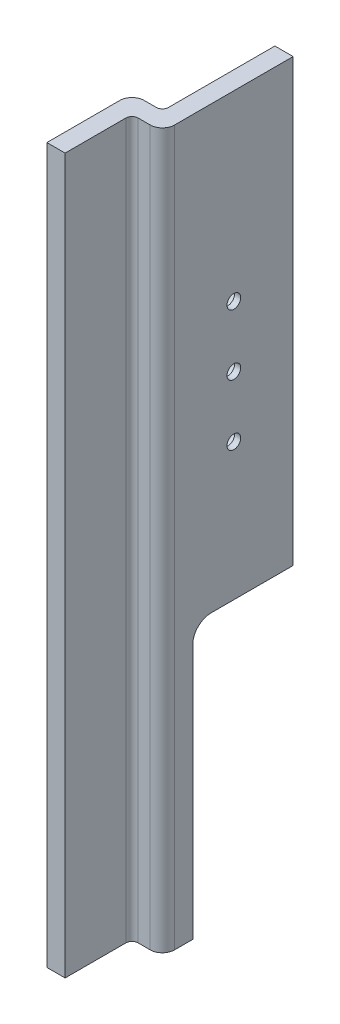
ISO-10303-21;
HEADER;
FILE_DESCRIPTION(('STEP AP214'),'2;1');
FILE_NAME('part.step','',(''),(''),'','','');
FILE_SCHEMA(('AUTOMOTIVE_DESIGN { 1 0 10303 214 1 1 1 1 }'));
ENDSEC;
DATA;
#1=APPLICATION_CONTEXT('core data for automotive mechanical design processes');
#2=APPLICATION_PROTOCOL_DEFINITION('international standard','automotive_design',2000,#1);
#3=PRODUCT_CONTEXT('',#1,'mechanical');
#4=PRODUCT('Part','Part','',(#3));
#5=PRODUCT_RELATED_PRODUCT_CATEGORY('part','',(#4));
#6=PRODUCT_DEFINITION_FORMATION('','',#4);
#7=PRODUCT_DEFINITION_CONTEXT('part definition',#1,'design');
#8=PRODUCT_DEFINITION('design','',#6,#7);
#9=PRODUCT_DEFINITION_SHAPE('','',#8);
#10=(LENGTH_UNIT() NAMED_UNIT(*) SI_UNIT(.MILLI.,.METRE.));
#11=(NAMED_UNIT(*) PLANE_ANGLE_UNIT() SI_UNIT($,.RADIAN.));
#12=(NAMED_UNIT(*) SI_UNIT($,.STERADIAN.) SOLID_ANGLE_UNIT());
#13=UNCERTAINTY_MEASURE_WITH_UNIT(LENGTH_MEASURE(1.E-05),#10,'distance_accuracy_value','');
#14=(GEOMETRIC_REPRESENTATION_CONTEXT(3) GLOBAL_UNCERTAINTY_ASSIGNED_CONTEXT((#13)) GLOBAL_UNIT_ASSIGNED_CONTEXT((#10,
#11,#12)) REPRESENTATION_CONTEXT('',''));
#15=CARTESIAN_POINT('',(0.,0.,0.));
#16=DIRECTION('',(0.,0.,1.));
#17=DIRECTION('',(1.,0.,0.));
#18=AXIS2_PLACEMENT_3D('',#15,#16,#17);
#19=CARTESIAN_POINT('',(-2.,235.,-4.5));
#20=DIRECTION('',(0.,1.,0.));
#21=DIRECTION('',(1.,0.,0.));
#22=AXIS2_PLACEMENT_3D('',#19,#20,#21);
#23=PLANE('',#22);
#24=CARTESIAN_POINT('',(-6.,235.,4.));
#25=DIRECTION('',(0.,-1.,0.));
#26=DIRECTION('',(-0.707106781186547,0.,-0.707106781186548));
#27=AXIS2_PLACEMENT_3D('',#24,#25,#26);
#28=CIRCLE('',#27,4.);
#29=CARTESIAN_POINT('',(-10.,235.,4.));
#30=VERTEX_POINT('',#29);
#31=CARTESIAN_POINT('',(-6.,235.,0.));
#32=VERTEX_POINT('',#31);
#33=EDGE_CURVE('E219',#30,#32,#28,.T.);
#34=ORIENTED_EDGE('',*,*,#33,.F.);
#35=DIRECTION('',(0.,0.,1.));
#36=VECTOR('',#35,1.);
#37=CARTESIAN_POINT('',(-10.,235.,28.));
#38=LINE('',#37,#36);
#39=CARTESIAN_POINT('',(-10.,235.,28.));
#40=VERTEX_POINT('',#39);
#41=EDGE_CURVE('E277',#30,#40,#38,.T.);
#42=ORIENTED_EDGE('',*,*,#41,.T.);
#43=DIRECTION('',(1.,0.,0.));
#44=VECTOR('',#43,1.);
#45=CARTESIAN_POINT('',(-4.,235.,28.));
#46=LINE('',#45,#44);
#47=CARTESIAN_POINT('',(-4.,235.,28.));
#48=VERTEX_POINT('',#47);
#49=EDGE_CURVE('E45',#40,#48,#46,.T.);
#50=ORIENTED_EDGE('',*,*,#49,.T.);
#51=DIRECTION('',(0.,0.,-1.));
#52=VECTOR('',#51,1.);
#53=CARTESIAN_POINT('',(-4.,235.,6.));
#54=LINE('',#53,#52);
#55=CARTESIAN_POINT('',(-4.,235.,8.));
#56=VERTEX_POINT('',#55);
#57=EDGE_CURVE('E248',#48,#56,#54,.T.);
#58=ORIENTED_EDGE('',*,*,#57,.T.);
#59=CARTESIAN_POINT('',(-2.,235.,8.));
#60=DIRECTION('',(0.,1.,0.));
#61=DIRECTION('',(-0.707106781186548,0.,-0.707106781186547));
#62=AXIS2_PLACEMENT_3D('',#59,#60,#61);
#63=CIRCLE('',#62,2.);
#64=CARTESIAN_POINT('',(-2.,235.,6.));
#65=VERTEX_POINT('',#64);
#66=EDGE_CURVE('E318',#65,#56,#63,.T.);
#67=ORIENTED_EDGE('',*,*,#66,.F.);
#68=DIRECTION('',(1.,0.,0.));
#69=VECTOR('',#68,1.);
#70=CARTESIAN_POINT('',(6.,235.,6.));
#71=LINE('',#70,#69);
#72=CARTESIAN_POINT('',(2.,235.,6.));
#73=VERTEX_POINT('',#72);
#74=EDGE_CURVE('E311',#65,#73,#71,.T.);
#75=ORIENTED_EDGE('',*,*,#74,.T.);
#76=CARTESIAN_POINT('',(2.,235.,2.));
#77=DIRECTION('',(0.,-1.,0.));
#78=DIRECTION('',(0.707106781186548,0.,0.707106781186548));
#79=AXIS2_PLACEMENT_3D('',#76,#77,#78);
#80=CIRCLE('',#79,4.);
#81=CARTESIAN_POINT('',(6.,235.,2.));
#82=VERTEX_POINT('',#81);
#83=EDGE_CURVE('E250',#82,#73,#80,.T.);
#84=ORIENTED_EDGE('',*,*,#83,.F.);
#85=DIRECTION('',(0.,0.,-1.));
#86=VECTOR('',#85,1.);
#87=CARTESIAN_POINT('',(6.,235.,6.));
#88=LINE('',#87,#86);
#89=CARTESIAN_POINT('',(6.,235.,-37.));
#90=VERTEX_POINT('',#89);
#91=EDGE_CURVE('E11',#82,#90,#88,.T.);
#92=ORIENTED_EDGE('',*,*,#91,.T.);
#93=DIRECTION('',(-1.,0.,0.));
#94=VECTOR('',#93,1.);
#95=CARTESIAN_POINT('',(6.,235.,-37.));
#96=LINE('',#95,#94);
#97=CARTESIAN_POINT('',(0.,235.,-37.));
#98=VERTEX_POINT('',#97);
#99=EDGE_CURVE('E298',#90,#98,#96,.T.);
#100=ORIENTED_EDGE('',*,*,#99,.T.);
#101=DIRECTION('',(0.,0.,1.));
#102=VECTOR('',#101,1.);
#103=CARTESIAN_POINT('',(0.,235.,-37.));
#104=LINE('',#103,#102);
#105=CARTESIAN_POINT('',(0.,235.,-2.));
#106=VERTEX_POINT('',#105);
#107=EDGE_CURVE('E359',#98,#106,#104,.T.);
#108=ORIENTED_EDGE('',*,*,#107,.T.);
#109=CARTESIAN_POINT('',(-2.,235.,-2.));
#110=DIRECTION('',(0.,1.,0.));
#111=DIRECTION('',(0.707106781186548,0.,0.707106781186548));
#112=AXIS2_PLACEMENT_3D('',#109,#110,#111);
#113=CIRCLE('',#112,2.);
#114=CARTESIAN_POINT('',(-2.,235.,0.));
#115=VERTEX_POINT('',#114);
#116=EDGE_CURVE('E242',#115,#106,#113,.T.);
#117=ORIENTED_EDGE('',*,*,#116,.F.);
#118=DIRECTION('',(-1.,0.,0.));
#119=VECTOR('',#118,1.);
#120=CARTESIAN_POINT('',(0.,235.,0.));
#121=LINE('',#120,#119);
#122=EDGE_CURVE('E228',#115,#32,#121,.T.);
#123=ORIENTED_EDGE('',*,*,#122,.T.);
#124=EDGE_LOOP('',(#34,#42,#50,#58,#67,#75,#84,#92,#100,#108,#117,#123));
#125=FACE_BOUND('',#124,.T.);
#126=ADVANCED_FACE('F17',(#125),#23,.T.);
#127=CARTESIAN_POINT('',(6.,0.,6.));
#128=DIRECTION('',(1.,0.,0.));
#129=DIRECTION('',(0.,1.,0.));
#130=AXIS2_PLACEMENT_3D('',#127,#128,#129);
#131=PLANE('',#130);
#132=CARTESIAN_POINT('',(6.,175.,-17.5));
#133=DIRECTION('',(-1.,0.,0.));
#134=DIRECTION('',(0.,1.,0.));
#135=AXIS2_PLACEMENT_3D('',#132,#133,#134);
#136=CIRCLE('',#135,2.25);
#137=CARTESIAN_POINT('',(6.,172.75,-17.5));
#138=VERTEX_POINT('',#137);
#139=EDGE_CURVE('E331',#138,#138,#136,.T.);
#140=ORIENTED_EDGE('',*,*,#139,.T.);
#141=EDGE_LOOP('',(#140));
#142=FACE_BOUND('',#141,.T.);
#143=CARTESIAN_POINT('',(6.,155.,-17.5));
#144=DIRECTION('',(-1.,0.,0.));
#145=DIRECTION('',(0.,1.,0.));
#146=AXIS2_PLACEMENT_3D('',#143,#144,#145);
#147=CIRCLE('',#146,2.25);
#148=CARTESIAN_POINT('',(6.,152.75,-17.5));
#149=VERTEX_POINT('',#148);
#150=EDGE_CURVE('E323',#149,#149,#147,.T.);
#151=ORIENTED_EDGE('',*,*,#150,.T.);
#152=EDGE_LOOP('',(#151));
#153=FACE_BOUND('',#152,.T.);
#154=CARTESIAN_POINT('',(6.,135.,-17.5));
#155=DIRECTION('',(-1.,0.,0.));
#156=DIRECTION('',(0.,1.,0.));
#157=AXIS2_PLACEMENT_3D('',#154,#155,#156);
#158=CIRCLE('',#157,2.25);
#159=CARTESIAN_POINT('',(6.,132.75,-17.5));
#160=VERTEX_POINT('',#159);
#161=EDGE_CURVE('E444',#160,#160,#158,.T.);
#162=ORIENTED_EDGE('',*,*,#161,.T.);
#163=EDGE_LOOP('',(#162));
#164=FACE_BOUND('',#163,.T.);
#165=DIRECTION('',(0.,1.,0.));
#166=VECTOR('',#165,1.);
#167=CARTESIAN_POINT('',(6.,0.,2.));
#168=LINE('',#167,#166);
#169=CARTESIAN_POINT('',(6.,0.,2.));
#170=VERTEX_POINT('',#169);
#171=EDGE_CURVE('E307',#170,#82,#168,.T.);
#172=ORIENTED_EDGE('',*,*,#171,.F.);
#173=DIRECTION('',(0.,0.,-1.));
#174=VECTOR('',#173,1.);
#175=CARTESIAN_POINT('',(6.,0.,6.));
#176=LINE('',#175,#174);
#177=CARTESIAN_POINT('',(6.,0.,-4.));
#178=VERTEX_POINT('',#177);
#179=EDGE_CURVE('E287',#170,#178,#176,.T.);
#180=ORIENTED_EDGE('',*,*,#179,.T.);
#181=DIRECTION('',(0.,1.,0.));
#182=VECTOR('',#181,1.);
#183=CARTESIAN_POINT('',(6.,0.,-4.));
#184=LINE('',#183,#182);
#185=CARTESIAN_POINT('',(6.,84.,-4.));
#186=VERTEX_POINT('',#185);
#187=EDGE_CURVE('E272',#178,#186,#184,.T.);
#188=ORIENTED_EDGE('',*,*,#187,.T.);
#189=CARTESIAN_POINT('',(6.,84.,-10.));
#190=DIRECTION('',(1.,0.,0.));
#191=DIRECTION('',(0.,0.707106781186546,0.707106781186549));
#192=AXIS2_PLACEMENT_3D('',#189,#190,#191);
#193=CIRCLE('',#192,6.);
#194=CARTESIAN_POINT('',(6.,90.,-10.));
#195=VERTEX_POINT('',#194);
#196=EDGE_CURVE('E335',#195,#186,#193,.T.);
#197=ORIENTED_EDGE('',*,*,#196,.F.);
#198=DIRECTION('',(0.,0.,-1.));
#199=VECTOR('',#198,1.);
#200=CARTESIAN_POINT('',(6.,90.,1.));
#201=LINE('',#200,#199);
#202=CARTESIAN_POINT('',(6.,90.,-37.));
#203=VERTEX_POINT('',#202);
#204=EDGE_CURVE('E355',#195,#203,#201,.T.);
#205=ORIENTED_EDGE('',*,*,#204,.T.);
#206=DIRECTION('',(0.,1.,0.));
#207=VECTOR('',#206,1.);
#208=CARTESIAN_POINT('',(6.,0.,-37.));
#209=LINE('',#208,#207);
#210=EDGE_CURVE('E26',#203,#90,#209,.T.);
#211=ORIENTED_EDGE('',*,*,#210,.T.);
#212=ORIENTED_EDGE('',*,*,#91,.F.);
#213=EDGE_LOOP('',(#172,#180,#188,#197,#205,#211,#212));
#214=FACE_BOUND('',#213,.T.);
#215=ADVANCED_FACE('F19',(#142,#153,#164,#214),#131,.T.);
#216=CARTESIAN_POINT('',(6.,0.,-37.));
#217=DIRECTION('',(0.,0.,-1.));
#218=DIRECTION('',(0.,-1.,0.));
#219=AXIS2_PLACEMENT_3D('',#216,#217,#218);
#220=PLANE('',#219);
#221=DIRECTION('',(-1.,0.,0.));
#222=VECTOR('',#221,1.);
#223=CARTESIAN_POINT('',(6.,90.,-37.));
#224=LINE('',#223,#222);
#225=CARTESIAN_POINT('',(0.,90.,-37.));
#226=VERTEX_POINT('',#225);
#227=EDGE_CURVE('E354',#203,#226,#224,.T.);
#228=ORIENTED_EDGE('',*,*,#227,.T.);
#229=DIRECTION('',(0.,1.,0.));
#230=VECTOR('',#229,1.);
#231=CARTESIAN_POINT('',(0.,0.,-37.));
#232=LINE('',#231,#230);
#233=EDGE_CURVE('E362',#226,#98,#232,.T.);
#234=ORIENTED_EDGE('',*,*,#233,.T.);
#235=ORIENTED_EDGE('',*,*,#99,.F.);
#236=ORIENTED_EDGE('',*,*,#210,.F.);
#237=EDGE_LOOP('',(#228,#234,#235,#236));
#238=FACE_BOUND('',#237,.T.);
#239=ADVANCED_FACE('F655',(#238),#220,.T.);
#240=CARTESIAN_POINT('',(-10.,0.,28.));
#241=DIRECTION('',(0.,0.,1.));
#242=DIRECTION('',(1.,0.,0.));
#243=AXIS2_PLACEMENT_3D('',#240,#241,#242);
#244=PLANE('',#243);
#245=DIRECTION('',(-1.,0.,0.));
#246=VECTOR('',#245,1.);
#247=CARTESIAN_POINT('',(-4.,0.,28.));
#248=LINE('',#247,#246);
#249=CARTESIAN_POINT('',(-4.,0.,28.));
#250=VERTEX_POINT('',#249);
#251=CARTESIAN_POINT('',(-10.,0.,28.));
#252=VERTEX_POINT('',#251);
#253=EDGE_CURVE('E255',#250,#252,#248,.T.);
#254=ORIENTED_EDGE('',*,*,#253,.F.);
#255=DIRECTION('',(0.,1.,0.));
#256=VECTOR('',#255,1.);
#257=CARTESIAN_POINT('',(-4.,0.,28.));
#258=LINE('',#257,#256);
#259=EDGE_CURVE('E246',#250,#48,#258,.T.);
#260=ORIENTED_EDGE('',*,*,#259,.T.);
#261=ORIENTED_EDGE('',*,*,#49,.F.);
#262=DIRECTION('',(0.,1.,0.));
#263=VECTOR('',#262,1.);
#264=CARTESIAN_POINT('',(-10.,0.,28.));
#265=LINE('',#264,#263);
#266=EDGE_CURVE('E267',#252,#40,#265,.T.);
#267=ORIENTED_EDGE('',*,*,#266,.F.);
#268=EDGE_LOOP('',(#254,#260,#261,#267));
#269=FACE_BOUND('',#268,.T.);
#270=ADVANCED_FACE('F658',(#269),#244,.T.);
#271=CARTESIAN_POINT('',(-4.,0.,28.));
#272=DIRECTION('',(1.,0.,0.));
#273=DIRECTION('',(0.,1.,0.));
#274=AXIS2_PLACEMENT_3D('',#271,#272,#273);
#275=PLANE('',#274);
#276=DIRECTION('',(0.,-1.,0.));
#277=VECTOR('',#276,1.);
#278=CARTESIAN_POINT('',(-4.,0.,8.));
#279=LINE('',#278,#277);
#280=CARTESIAN_POINT('',(-4.,0.,8.));
#281=VERTEX_POINT('',#280);
#282=EDGE_CURVE('E322',#56,#281,#279,.T.);
#283=ORIENTED_EDGE('',*,*,#282,.F.);
#284=ORIENTED_EDGE('',*,*,#57,.F.);
#285=ORIENTED_EDGE('',*,*,#259,.F.);
#286=DIRECTION('',(0.,0.,1.));
#287=VECTOR('',#286,1.);
#288=CARTESIAN_POINT('',(-4.,0.,6.));
#289=LINE('',#288,#287);
#290=EDGE_CURVE('E256',#281,#250,#289,.T.);
#291=ORIENTED_EDGE('',*,*,#290,.F.);
#292=EDGE_LOOP('',(#283,#284,#285,#291));
#293=FACE_BOUND('',#292,.T.);
#294=ADVANCED_FACE('F666',(#293),#275,.T.);
#295=CARTESIAN_POINT('',(0.,0.,-37.));
#296=DIRECTION('',(-1.,0.,0.));
#297=DIRECTION('',(0.,0.,1.));
#298=AXIS2_PLACEMENT_3D('',#295,#296,#297);
#299=PLANE('',#298);
#300=CARTESIAN_POINT('',(0.,135.,-17.5));
#301=DIRECTION('',(1.,0.,0.));
#302=DIRECTION('',(0.,-1.,0.));
#303=AXIS2_PLACEMENT_3D('',#300,#301,#302);
#304=CIRCLE('',#303,4.);
#305=CARTESIAN_POINT('',(0.,139.,-17.5));
#306=VERTEX_POINT('',#305);
#307=EDGE_CURVE('E570',#306,#306,#304,.T.);
#308=ORIENTED_EDGE('',*,*,#307,.T.);
#309=EDGE_LOOP('',(#308));
#310=FACE_BOUND('',#309,.T.);
#311=CARTESIAN_POINT('',(0.,155.,-17.5));
#312=DIRECTION('',(1.,0.,0.));
#313=DIRECTION('',(0.,-1.,0.));
#314=AXIS2_PLACEMENT_3D('',#311,#312,#313);
#315=CIRCLE('',#314,4.);
#316=CARTESIAN_POINT('',(0.,159.,-17.5));
#317=VERTEX_POINT('',#316);
#318=EDGE_CURVE('E595',#317,#317,#315,.T.);
#319=ORIENTED_EDGE('',*,*,#318,.T.);
#320=EDGE_LOOP('',(#319));
#321=FACE_BOUND('',#320,.T.);
#322=CARTESIAN_POINT('',(0.,175.,-17.5));
#323=DIRECTION('',(1.,0.,0.));
#324=DIRECTION('',(0.,-1.,0.));
#325=AXIS2_PLACEMENT_3D('',#322,#323,#324);
#326=CIRCLE('',#325,4.);
#327=CARTESIAN_POINT('',(0.,179.,-17.5));
#328=VERTEX_POINT('',#327);
#329=EDGE_CURVE('E618',#328,#328,#326,.T.);
#330=ORIENTED_EDGE('',*,*,#329,.T.);
#331=EDGE_LOOP('',(#330));
#332=FACE_BOUND('',#331,.T.);
#333=DIRECTION('',(0.,-1.,0.));
#334=VECTOR('',#333,1.);
#335=CARTESIAN_POINT('',(0.,0.,-2.));
#336=LINE('',#335,#334);
#337=CARTESIAN_POINT('',(0.,0.,-2.));
#338=VERTEX_POINT('',#337);
#339=EDGE_CURVE('E235',#106,#338,#336,.T.);
#340=ORIENTED_EDGE('',*,*,#339,.F.);
#341=ORIENTED_EDGE('',*,*,#107,.F.);
#342=ORIENTED_EDGE('',*,*,#233,.F.);
#343=DIRECTION('',(0.,0.,1.));
#344=VECTOR('',#343,1.);
#345=CARTESIAN_POINT('',(0.,90.,-20.5));
#346=LINE('',#345,#344);
#347=CARTESIAN_POINT('',(0.,90.,-10.));
#348=VERTEX_POINT('',#347);
#349=EDGE_CURVE('E351',#226,#348,#346,.T.);
#350=ORIENTED_EDGE('',*,*,#349,.T.);
#351=CARTESIAN_POINT('',(0.,84.,-10.));
#352=DIRECTION('',(-1.,0.,0.));
#353=DIRECTION('',(0.,0.707106781186546,0.707106781186549));
#354=AXIS2_PLACEMENT_3D('',#351,#352,#353);
#355=CIRCLE('',#354,6.);
#356=CARTESIAN_POINT('',(0.,84.,-4.));
#357=VERTEX_POINT('',#356);
#358=EDGE_CURVE('E273',#357,#348,#355,.T.);
#359=ORIENTED_EDGE('',*,*,#358,.F.);
#360=DIRECTION('',(0.,-1.,0.));
#361=VECTOR('',#360,1.);
#362=CARTESIAN_POINT('',(0.,0.,-4.));
#363=LINE('',#362,#361);
#364=CARTESIAN_POINT('',(0.,0.,-4.));
#365=VERTEX_POINT('',#364);
#366=EDGE_CURVE('E348',#357,#365,#363,.T.);
#367=ORIENTED_EDGE('',*,*,#366,.T.);
#368=DIRECTION('',(0.,0.,1.));
#369=VECTOR('',#368,1.);
#370=CARTESIAN_POINT('',(0.,0.,-37.));
#371=LINE('',#370,#369);
#372=EDGE_CURVE('E280',#365,#338,#371,.T.);
#373=ORIENTED_EDGE('',*,*,#372,.T.);
#374=EDGE_LOOP('',(#340,#341,#342,#350,#359,#367,#373));
#375=FACE_BOUND('',#374,.T.);
#376=ADVANCED_FACE('F627',(#310,#321,#332,#375),#299,.T.);
#377=CARTESIAN_POINT('',(6.,90.,-4.));
#378=DIRECTION('',(0.,1.,0.));
#379=DIRECTION('',(1.,0.,0.));
#380=AXIS2_PLACEMENT_3D('',#377,#378,#379);
#381=PLANE('',#380);
#382=DIRECTION('',(1.,0.,0.));
#383=VECTOR('',#382,1.);
#384=CARTESIAN_POINT('',(6.,90.,-10.));
#385=LINE('',#384,#383);
#386=EDGE_CURVE('E268',#348,#195,#385,.T.);
#387=ORIENTED_EDGE('',*,*,#386,.F.);
#388=ORIENTED_EDGE('',*,*,#349,.F.);
#389=ORIENTED_EDGE('',*,*,#227,.F.);
#390=ORIENTED_EDGE('',*,*,#204,.F.);
#391=EDGE_LOOP('',(#387,#388,#389,#390));
#392=FACE_BOUND('',#391,.T.);
#393=ADVANCED_FACE('F674',(#392),#381,.F.);
#394=CARTESIAN_POINT('',(6.,0.,-4.));
#395=DIRECTION('',(0.,0.,1.));
#396=DIRECTION('',(1.,0.,0.));
#397=AXIS2_PLACEMENT_3D('',#394,#395,#396);
#398=PLANE('',#397);
#399=DIRECTION('',(-1.,0.,0.));
#400=VECTOR('',#399,1.);
#401=CARTESIAN_POINT('',(6.,84.,-4.));
#402=LINE('',#401,#400);
#403=EDGE_CURVE('E339',#186,#357,#402,.T.);
#404=ORIENTED_EDGE('',*,*,#403,.F.);
#405=ORIENTED_EDGE('',*,*,#187,.F.);
#406=DIRECTION('',(1.,0.,0.));
#407=VECTOR('',#406,1.);
#408=CARTESIAN_POINT('',(2.,0.,-4.));
#409=LINE('',#408,#407);
#410=EDGE_CURVE('E283',#365,#178,#409,.T.);
#411=ORIENTED_EDGE('',*,*,#410,.F.);
#412=ORIENTED_EDGE('',*,*,#366,.F.);
#413=EDGE_LOOP('',(#404,#405,#411,#412));
#414=FACE_BOUND('',#413,.T.);
#415=ADVANCED_FACE('F685',(#414),#398,.F.);
#416=CARTESIAN_POINT('',(6.,84.,-10.));
#417=DIRECTION('',(-1.,0.,0.));
#418=DIRECTION('',(0.,0.707106781186546,0.707106781186549));
#419=AXIS2_PLACEMENT_3D('',#416,#417,#418);
#420=CYLINDRICAL_SURFACE('',#419,6.);
#421=ORIENTED_EDGE('',*,*,#196,.T.);
#422=ORIENTED_EDGE('',*,*,#403,.T.);
#423=ORIENTED_EDGE('',*,*,#358,.T.);
#424=ORIENTED_EDGE('',*,*,#386,.T.);
#425=EDGE_LOOP('',(#421,#422,#423,#424));
#426=FACE_BOUND('',#425,.T.);
#427=ADVANCED_FACE('F729',(#426),#420,.F.);
#428=CARTESIAN_POINT('',(6.,175.,-17.5));
#429=DIRECTION('',(-1.,0.,0.));
#430=DIRECTION('',(0.,1.,0.));
#431=AXIS2_PLACEMENT_3D('',#428,#429,#430);
#432=CYLINDRICAL_SURFACE('',#431,2.25);
#433=ORIENTED_EDGE('',*,*,#139,.F.);
#434=DIRECTION('',(-1.,0.,0.));
#435=VECTOR('',#434,1.);
#436=CARTESIAN_POINT('',(6.,172.75,-17.5));
#437=LINE('',#436,#435);
#438=CARTESIAN_POINT('',(4.,172.75,-17.5));
#439=VERTEX_POINT('',#438);
#440=EDGE_CURVE('E332',#138,#439,#437,.T.);
#441=ORIENTED_EDGE('',*,*,#440,.T.);
#442=CARTESIAN_POINT('',(4.,175.,-17.5));
#443=DIRECTION('',(-1.,0.,0.));
#444=DIRECTION('',(0.,1.,0.));
#445=AXIS2_PLACEMENT_3D('',#442,#443,#444);
#446=CIRCLE('',#445,2.25);
#447=EDGE_CURVE('E601',#439,#439,#446,.T.);
#448=ORIENTED_EDGE('',*,*,#447,.T.);
#449=ORIENTED_EDGE('',*,*,#440,.F.);
#450=EDGE_LOOP('',(#433,#441,#448,#449));
#451=FACE_BOUND('',#450,.T.);
#452=ADVANCED_FACE('F726',(#451),#432,.F.);
#453=CARTESIAN_POINT('',(6.,155.,-17.5));
#454=DIRECTION('',(-1.,0.,0.));
#455=DIRECTION('',(0.,1.,0.));
#456=AXIS2_PLACEMENT_3D('',#453,#454,#455);
#457=CYLINDRICAL_SURFACE('',#456,2.25);
#458=ORIENTED_EDGE('',*,*,#150,.F.);
#459=DIRECTION('',(-1.,0.,0.));
#460=VECTOR('',#459,1.);
#461=CARTESIAN_POINT('',(6.,152.75,-17.5));
#462=LINE('',#461,#460);
#463=CARTESIAN_POINT('',(4.,152.75,-17.5));
#464=VERTEX_POINT('',#463);
#465=EDGE_CURVE('E327',#149,#464,#462,.T.);
#466=ORIENTED_EDGE('',*,*,#465,.T.);
#467=CARTESIAN_POINT('',(4.,155.,-17.5));
#468=DIRECTION('',(-1.,0.,0.));
#469=DIRECTION('',(0.,1.,0.));
#470=AXIS2_PLACEMENT_3D('',#467,#468,#469);
#471=CIRCLE('',#470,2.25);
#472=EDGE_CURVE('E576',#464,#464,#471,.T.);
#473=ORIENTED_EDGE('',*,*,#472,.T.);
#474=ORIENTED_EDGE('',*,*,#465,.F.);
#475=EDGE_LOOP('',(#458,#466,#473,#474));
#476=FACE_BOUND('',#475,.T.);
#477=ADVANCED_FACE('F724',(#476),#457,.F.);
#478=CARTESIAN_POINT('',(6.,135.,-17.5));
#479=DIRECTION('',(-1.,0.,0.));
#480=DIRECTION('',(0.,1.,0.));
#481=AXIS2_PLACEMENT_3D('',#478,#479,#480);
#482=CYLINDRICAL_SURFACE('',#481,2.25);
#483=ORIENTED_EDGE('',*,*,#161,.F.);
#484=DIRECTION('',(-1.,0.,0.));
#485=VECTOR('',#484,1.);
#486=CARTESIAN_POINT('',(6.,132.75,-17.5));
#487=LINE('',#486,#485);
#488=CARTESIAN_POINT('',(4.,132.75,-17.5));
#489=VERTEX_POINT('',#488);
#490=EDGE_CURVE('E328',#160,#489,#487,.T.);
#491=ORIENTED_EDGE('',*,*,#490,.T.);
#492=CARTESIAN_POINT('',(4.,135.,-17.5));
#493=DIRECTION('',(-1.,0.,0.));
#494=DIRECTION('',(0.,1.,0.));
#495=AXIS2_PLACEMENT_3D('',#492,#493,#494);
#496=CIRCLE('',#495,2.25);
#497=EDGE_CURVE('E551',#489,#489,#496,.T.);
#498=ORIENTED_EDGE('',*,*,#497,.T.);
#499=ORIENTED_EDGE('',*,*,#490,.F.);
#500=EDGE_LOOP('',(#483,#491,#498,#499));
#501=FACE_BOUND('',#500,.T.);
#502=ADVANCED_FACE('F721',(#501),#482,.F.);
#503=CARTESIAN_POINT('',(-2.,0.,8.));
#504=DIRECTION('',(0.,1.,0.));
#505=DIRECTION('',(-0.707106781186548,0.,-0.707106781186547));
#506=AXIS2_PLACEMENT_3D('',#503,#504,#505);
#507=CYLINDRICAL_SURFACE('',#506,2.);
#508=CARTESIAN_POINT('',(-2.,0.,8.));
#509=DIRECTION('',(0.,-1.,0.));
#510=DIRECTION('',(-0.707106781186548,0.,-0.707106781186547));
#511=AXIS2_PLACEMENT_3D('',#508,#509,#510);
#512=CIRCLE('',#511,2.);
#513=CARTESIAN_POINT('',(-2.,0.,6.));
#514=VERTEX_POINT('',#513);
#515=EDGE_CURVE('E260',#281,#514,#512,.T.);
#516=ORIENTED_EDGE('',*,*,#515,.T.);
#517=DIRECTION('',(0.,1.,0.));
#518=VECTOR('',#517,1.);
#519=CARTESIAN_POINT('',(-2.,0.,6.));
#520=LINE('',#519,#518);
#521=EDGE_CURVE('E314',#514,#65,#520,.T.);
#522=ORIENTED_EDGE('',*,*,#521,.T.);
#523=ORIENTED_EDGE('',*,*,#66,.T.);
#524=ORIENTED_EDGE('',*,*,#282,.T.);
#525=EDGE_LOOP('',(#516,#522,#523,#524));
#526=FACE_BOUND('',#525,.T.);
#527=ADVANCED_FACE('F698',(#526),#507,.F.);
#528=CARTESIAN_POINT('',(-4.,0.,6.));
#529=DIRECTION('',(0.,0.,1.));
#530=DIRECTION('',(1.,0.,0.));
#531=AXIS2_PLACEMENT_3D('',#528,#529,#530);
#532=PLANE('',#531);
#533=DIRECTION('',(0.,-1.,0.));
#534=VECTOR('',#533,1.);
#535=CARTESIAN_POINT('',(2.,0.,6.));
#536=LINE('',#535,#534);
#537=CARTESIAN_POINT('',(2.,0.,6.));
#538=VERTEX_POINT('',#537);
#539=EDGE_CURVE('E254',#73,#538,#536,.T.);
#540=ORIENTED_EDGE('',*,*,#539,.F.);
#541=ORIENTED_EDGE('',*,*,#74,.F.);
#542=ORIENTED_EDGE('',*,*,#521,.F.);
#543=DIRECTION('',(-1.,0.,0.));
#544=VECTOR('',#543,1.);
#545=CARTESIAN_POINT('',(6.,0.,6.));
#546=LINE('',#545,#544);
#547=EDGE_CURVE('E295',#538,#514,#546,.T.);
#548=ORIENTED_EDGE('',*,*,#547,.F.);
#549=EDGE_LOOP('',(#540,#541,#542,#548));
#550=FACE_BOUND('',#549,.T.);
#551=ADVANCED_FACE('F696',(#550),#532,.T.);
#552=CARTESIAN_POINT('',(2.,0.,2.));
#553=DIRECTION('',(0.,1.,0.));
#554=DIRECTION('',(0.707106781186548,0.,0.707106781186548));
#555=AXIS2_PLACEMENT_3D('',#552,#553,#554);
#556=CYLINDRICAL_SURFACE('',#555,4.);
#557=ORIENTED_EDGE('',*,*,#83,.T.);
#558=ORIENTED_EDGE('',*,*,#539,.T.);
#559=CARTESIAN_POINT('',(2.,0.,2.));
#560=DIRECTION('',(0.,1.,0.));
#561=DIRECTION('',(0.707106781186548,0.,0.707106781186548));
#562=AXIS2_PLACEMENT_3D('',#559,#560,#561);
#563=CIRCLE('',#562,4.);
#564=EDGE_CURVE('E291',#538,#170,#563,.T.);
#565=ORIENTED_EDGE('',*,*,#564,.T.);
#566=ORIENTED_EDGE('',*,*,#171,.T.);
#567=EDGE_LOOP('',(#557,#558,#565,#566));
#568=FACE_BOUND('',#567,.T.);
#569=ADVANCED_FACE('F692',(#568),#556,.T.);
#570=CARTESIAN_POINT('',(-2.,0.,-4.5));
#571=DIRECTION('',(0.,1.,0.));
#572=DIRECTION('',(1.,0.,0.));
#573=AXIS2_PLACEMENT_3D('',#570,#571,#572);
#574=PLANE('',#573);
#575=CARTESIAN_POINT('',(-6.,0.,4.));
#576=DIRECTION('',(0.,1.,0.));
#577=DIRECTION('',(-0.707106781186547,0.,-0.707106781186548));
#578=AXIS2_PLACEMENT_3D('',#575,#576,#577);
#579=CIRCLE('',#578,4.);
#580=CARTESIAN_POINT('',(-6.,0.,0.));
#581=VERTEX_POINT('',#580);
#582=CARTESIAN_POINT('',(-10.,0.,4.));
#583=VERTEX_POINT('',#582);
#584=EDGE_CURVE('E205',#581,#583,#579,.T.);
#585=ORIENTED_EDGE('',*,*,#584,.F.);
#586=DIRECTION('',(-1.,0.,0.));
#587=VECTOR('',#586,1.);
#588=CARTESIAN_POINT('',(0.,0.,0.));
#589=LINE('',#588,#587);
#590=CARTESIAN_POINT('',(-2.,0.,0.));
#591=VERTEX_POINT('',#590);
#592=EDGE_CURVE('E210',#591,#581,#589,.T.);
#593=ORIENTED_EDGE('',*,*,#592,.F.);
#594=CARTESIAN_POINT('',(-2.,0.,-2.));
#595=DIRECTION('',(0.,-1.,0.));
#596=DIRECTION('',(0.707106781186548,0.,0.707106781186548));
#597=AXIS2_PLACEMENT_3D('',#594,#595,#596);
#598=CIRCLE('',#597,2.);
#599=EDGE_CURVE('E546',#338,#591,#598,.T.);
#600=ORIENTED_EDGE('',*,*,#599,.F.);
#601=ORIENTED_EDGE('',*,*,#372,.F.);
#602=ORIENTED_EDGE('',*,*,#410,.T.);
#603=ORIENTED_EDGE('',*,*,#179,.F.);
#604=ORIENTED_EDGE('',*,*,#564,.F.);
#605=ORIENTED_EDGE('',*,*,#547,.T.);
#606=ORIENTED_EDGE('',*,*,#515,.F.);
#607=ORIENTED_EDGE('',*,*,#290,.T.);
#608=ORIENTED_EDGE('',*,*,#253,.T.);
#609=DIRECTION('',(0.,0.,-1.));
#610=VECTOR('',#609,1.);
#611=CARTESIAN_POINT('',(-10.,0.,28.));
#612=LINE('',#611,#610);
#613=EDGE_CURVE('E213',#252,#583,#612,.T.);
#614=ORIENTED_EDGE('',*,*,#613,.T.);
#615=EDGE_LOOP('',(#585,#593,#600,#601,#602,#603,#604,#605,#606,#607,#608,#614));
#616=FACE_BOUND('',#615,.T.);
#617=ADVANCED_FACE('F207',(#616),#574,.F.);
#618=CARTESIAN_POINT('',(-10.,0.,0.));
#619=DIRECTION('',(-1.,0.,0.));
#620=DIRECTION('',(0.,1.,0.));
#621=AXIS2_PLACEMENT_3D('',#618,#619,#620);
#622=PLANE('',#621);
#623=DIRECTION('',(0.,1.,0.));
#624=VECTOR('',#623,1.);
#625=CARTESIAN_POINT('',(-10.,0.,4.));
#626=LINE('',#625,#624);
#627=EDGE_CURVE('E218',#583,#30,#626,.T.);
#628=ORIENTED_EDGE('',*,*,#627,.F.);
#629=ORIENTED_EDGE('',*,*,#613,.F.);
#630=ORIENTED_EDGE('',*,*,#266,.T.);
#631=ORIENTED_EDGE('',*,*,#41,.F.);
#632=EDGE_LOOP('',(#628,#629,#630,#631));
#633=FACE_BOUND('',#632,.T.);
#634=ADVANCED_FACE('F706',(#633),#622,.T.);
#635=CARTESIAN_POINT('',(-6.,0.,4.));
#636=DIRECTION('',(0.,1.,0.));
#637=DIRECTION('',(-0.707106781186547,0.,-0.707106781186548));
#638=AXIS2_PLACEMENT_3D('',#635,#636,#637);
#639=CYLINDRICAL_SURFACE('',#638,4.);
#640=ORIENTED_EDGE('',*,*,#33,.T.);
#641=DIRECTION('',(0.,-1.,0.));
#642=VECTOR('',#641,1.);
#643=CARTESIAN_POINT('',(-6.,0.,0.));
#644=LINE('',#643,#642);
#645=EDGE_CURVE('E222',#32,#581,#644,.T.);
#646=ORIENTED_EDGE('',*,*,#645,.T.);
#647=ORIENTED_EDGE('',*,*,#584,.T.);
#648=ORIENTED_EDGE('',*,*,#627,.T.);
#649=EDGE_LOOP('',(#640,#646,#647,#648));
#650=FACE_BOUND('',#649,.T.);
#651=ADVANCED_FACE('F223',(#650),#639,.T.);
#652=CARTESIAN_POINT('',(0.,0.,0.));
#653=DIRECTION('',(0.,0.,-1.));
#654=DIRECTION('',(0.,-1.,0.));
#655=AXIS2_PLACEMENT_3D('',#652,#653,#654);
#656=PLANE('',#655);
#657=DIRECTION('',(0.,1.,0.));
#658=VECTOR('',#657,1.);
#659=CARTESIAN_POINT('',(-2.,0.,0.));
#660=LINE('',#659,#658);
#661=EDGE_CURVE('E232',#591,#115,#660,.T.);
#662=ORIENTED_EDGE('',*,*,#661,.F.);
#663=ORIENTED_EDGE('',*,*,#592,.T.);
#664=ORIENTED_EDGE('',*,*,#645,.F.);
#665=ORIENTED_EDGE('',*,*,#122,.F.);
#666=EDGE_LOOP('',(#662,#663,#664,#665));
#667=FACE_BOUND('',#666,.T.);
#668=ADVANCED_FACE('F230',(#667),#656,.T.);
#669=CARTESIAN_POINT('',(-2.,0.,-2.));
#670=DIRECTION('',(0.,1.,0.));
#671=DIRECTION('',(0.707106781186548,0.,0.707106781186548));
#672=AXIS2_PLACEMENT_3D('',#669,#670,#671);
#673=CYLINDRICAL_SURFACE('',#672,2.);
#674=ORIENTED_EDGE('',*,*,#599,.T.);
#675=ORIENTED_EDGE('',*,*,#661,.T.);
#676=ORIENTED_EDGE('',*,*,#116,.T.);
#677=ORIENTED_EDGE('',*,*,#339,.T.);
#678=EDGE_LOOP('',(#674,#675,#676,#677));
#679=FACE_BOUND('',#678,.T.);
#680=ADVANCED_FACE('F679',(#679),#673,.F.);
#681=CARTESIAN_POINT('',(4.,135.,-17.5));
#682=DIRECTION('',(-1.,0.,0.));
#683=DIRECTION('',(0.,0.,1.));
#684=AXIS2_PLACEMENT_3D('',#681,#682,#683);
#685=PLANE('',#684);
#686=ORIENTED_EDGE('',*,*,#497,.F.);
#687=EDGE_LOOP('',(#686));
#688=FACE_BOUND('',#687,.T.);
#689=CARTESIAN_POINT('',(4.,135.,-17.5));
#690=DIRECTION('',(1.,0.,0.));
#691=DIRECTION('',(0.,-1.,0.));
#692=AXIS2_PLACEMENT_3D('',#689,#690,#691);
#693=CIRCLE('',#692,4.);
#694=CARTESIAN_POINT('',(4.,139.,-17.5));
#695=VERTEX_POINT('',#694);
#696=EDGE_CURVE('E558',#695,#695,#693,.T.);
#697=ORIENTED_EDGE('',*,*,#696,.F.);
#698=EDGE_LOOP('',(#697));
#699=FACE_BOUND('',#698,.T.);
#700=ADVANCED_FACE('F886',(#688,#699),#685,.T.);
#701=CARTESIAN_POINT('',(0.,135.,-17.5));
#702=DIRECTION('',(1.,0.,0.));
#703=DIRECTION('',(0.,-1.,0.));
#704=AXIS2_PLACEMENT_3D('',#701,#702,#703);
#705=CYLINDRICAL_SURFACE('',#704,4.);
#706=ORIENTED_EDGE('',*,*,#307,.F.);
#707=DIRECTION('',(1.,0.,0.));
#708=VECTOR('',#707,1.);
#709=CARTESIAN_POINT('',(0.,139.,-17.5));
#710=LINE('',#709,#708);
#711=EDGE_CURVE('E564',#306,#695,#710,.T.);
#712=ORIENTED_EDGE('',*,*,#711,.T.);
#713=ORIENTED_EDGE('',*,*,#696,.T.);
#714=ORIENTED_EDGE('',*,*,#711,.F.);
#715=EDGE_LOOP('',(#706,#712,#713,#714));
#716=FACE_BOUND('',#715,.T.);
#717=ADVANCED_FACE('F881',(#716),#705,.F.);
#718=CARTESIAN_POINT('',(4.,155.,-17.5));
#719=DIRECTION('',(-1.,0.,0.));
#720=DIRECTION('',(0.,0.,1.));
#721=AXIS2_PLACEMENT_3D('',#718,#719,#720);
#722=PLANE('',#721);
#723=ORIENTED_EDGE('',*,*,#472,.F.);
#724=EDGE_LOOP('',(#723));
#725=FACE_BOUND('',#724,.T.);
#726=CARTESIAN_POINT('',(4.,155.,-17.5));
#727=DIRECTION('',(1.,0.,0.));
#728=DIRECTION('',(0.,-1.,0.));
#729=AXIS2_PLACEMENT_3D('',#726,#727,#728);
#730=CIRCLE('',#729,4.);
#731=CARTESIAN_POINT('',(4.,159.,-17.5));
#732=VERTEX_POINT('',#731);
#733=EDGE_CURVE('E582',#732,#732,#730,.T.);
#734=ORIENTED_EDGE('',*,*,#733,.F.);
#735=EDGE_LOOP('',(#734));
#736=FACE_BOUND('',#735,.T.);
#737=ADVANCED_FACE('F645',(#725,#736),#722,.T.);
#738=CARTESIAN_POINT('',(0.,155.,-17.5));
#739=DIRECTION('',(1.,0.,0.));
#740=DIRECTION('',(0.,-1.,0.));
#741=AXIS2_PLACEMENT_3D('',#738,#739,#740);
#742=CYLINDRICAL_SURFACE('',#741,4.);
#743=ORIENTED_EDGE('',*,*,#318,.F.);
#744=DIRECTION('',(1.,0.,0.));
#745=VECTOR('',#744,1.);
#746=CARTESIAN_POINT('',(0.,159.,-17.5));
#747=LINE('',#746,#745);
#748=EDGE_CURVE('E588',#317,#732,#747,.T.);
#749=ORIENTED_EDGE('',*,*,#748,.T.);
#750=ORIENTED_EDGE('',*,*,#733,.T.);
#751=ORIENTED_EDGE('',*,*,#748,.F.);
#752=EDGE_LOOP('',(#743,#749,#750,#751));
#753=FACE_BOUND('',#752,.T.);
#754=ADVANCED_FACE('F635',(#753),#742,.F.);
#755=CARTESIAN_POINT('',(4.,175.,-17.5));
#756=DIRECTION('',(-1.,0.,0.));
#757=DIRECTION('',(0.,0.,1.));
#758=AXIS2_PLACEMENT_3D('',#755,#756,#757);
#759=PLANE('',#758);
#760=ORIENTED_EDGE('',*,*,#447,.F.);
#761=EDGE_LOOP('',(#760));
#762=FACE_BOUND('',#761,.T.);
#763=CARTESIAN_POINT('',(4.,175.,-17.5));
#764=DIRECTION('',(1.,0.,0.));
#765=DIRECTION('',(0.,-1.,0.));
#766=AXIS2_PLACEMENT_3D('',#763,#764,#765);
#767=CIRCLE('',#766,4.);
#768=CARTESIAN_POINT('',(4.,179.,-17.5));
#769=VERTEX_POINT('',#768);
#770=EDGE_CURVE('E607',#769,#769,#767,.T.);
#771=ORIENTED_EDGE('',*,*,#770,.F.);
#772=EDGE_LOOP('',(#771));
#773=FACE_BOUND('',#772,.T.);
#774=ADVANCED_FACE('F633',(#762,#773),#759,.T.);
#775=CARTESIAN_POINT('',(0.,175.,-17.5));
#776=DIRECTION('',(1.,0.,0.));
#777=DIRECTION('',(0.,-1.,0.));
#778=AXIS2_PLACEMENT_3D('',#775,#776,#777);
#779=CYLINDRICAL_SURFACE('',#778,4.);
#780=ORIENTED_EDGE('',*,*,#329,.F.);
#781=DIRECTION('',(1.,0.,0.));
#782=VECTOR('',#781,1.);
#783=CARTESIAN_POINT('',(0.,179.,-17.5));
#784=LINE('',#783,#782);
#785=EDGE_CURVE('E612',#328,#769,#784,.T.);
#786=ORIENTED_EDGE('',*,*,#785,.T.);
#787=ORIENTED_EDGE('',*,*,#770,.T.);
#788=ORIENTED_EDGE('',*,*,#785,.F.);
#789=EDGE_LOOP('',(#780,#786,#787,#788));
#790=FACE_BOUND('',#789,.T.);
#791=ADVANCED_FACE('F630',(#790),#779,.F.);
#792=CLOSED_SHELL('',(#126,#215,#239,#270,#294,#376,#393,#415,#427,#452,#477,#502,#527,#551,
#569,#617,#634,#651,#668,#680,#700,#717,#737,#754,#774,#791));
#793=MANIFOLD_SOLID_BREP('B1',#792);
#794=ADVANCED_BREP_SHAPE_REPRESENTATION('',(#18,#793),#14);
#795=SHAPE_DEFINITION_REPRESENTATION(#9,#794);
ENDSEC;
END-ISO-10303-21;
